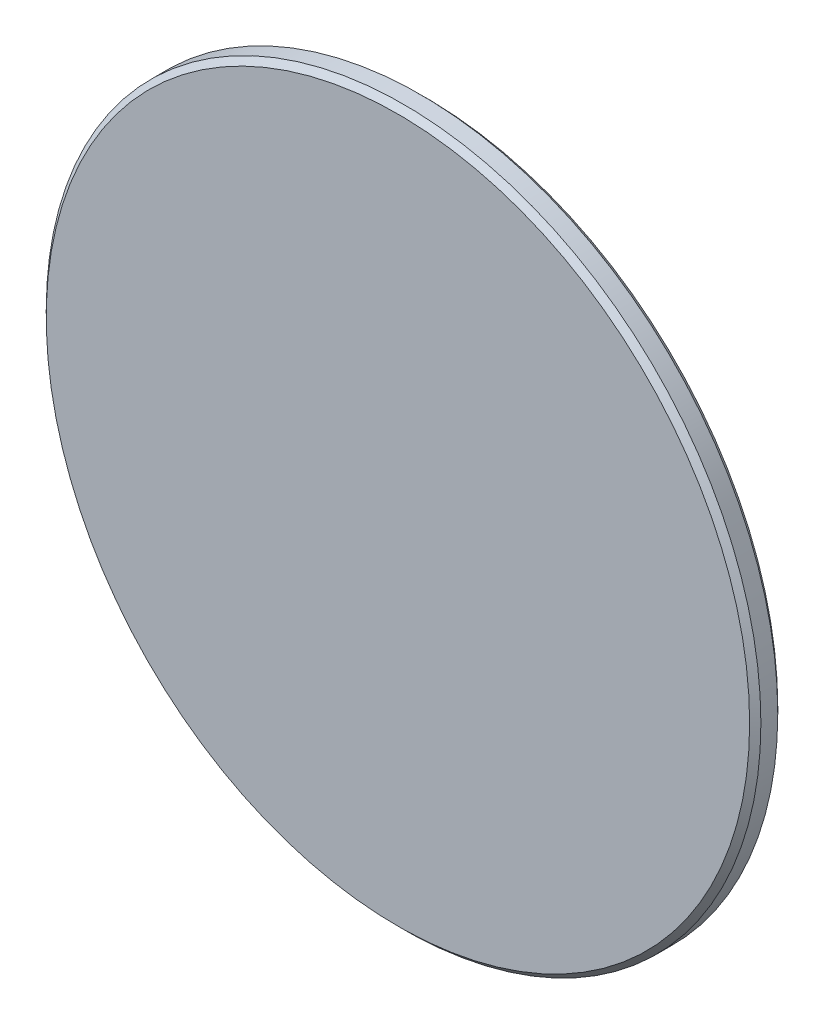
ISO-10303-21;
HEADER;
FILE_DESCRIPTION(('STEP AP214'),'2;1');
FILE_NAME('part.step','',(''),(''),'','','');
FILE_SCHEMA(('AUTOMOTIVE_DESIGN { 1 0 10303 214 1 1 1 1 }'));
ENDSEC;
DATA;
#1=APPLICATION_CONTEXT('core data for automotive mechanical design processes');
#2=APPLICATION_PROTOCOL_DEFINITION('international standard','automotive_design',2000,#1);
#3=PRODUCT_CONTEXT('',#1,'mechanical');
#4=PRODUCT('Part','Part','',(#3));
#5=PRODUCT_RELATED_PRODUCT_CATEGORY('part','',(#4));
#6=PRODUCT_DEFINITION_FORMATION('','',#4);
#7=PRODUCT_DEFINITION_CONTEXT('part definition',#1,'design');
#8=PRODUCT_DEFINITION('design','',#6,#7);
#9=PRODUCT_DEFINITION_SHAPE('','',#8);
#10=(LENGTH_UNIT() NAMED_UNIT(*) SI_UNIT(.MILLI.,.METRE.));
#11=(NAMED_UNIT(*) PLANE_ANGLE_UNIT() SI_UNIT($,.RADIAN.));
#12=(NAMED_UNIT(*) SI_UNIT($,.STERADIAN.) SOLID_ANGLE_UNIT());
#13=UNCERTAINTY_MEASURE_WITH_UNIT(LENGTH_MEASURE(1.E-05),#10,'distance_accuracy_value','');
#14=(GEOMETRIC_REPRESENTATION_CONTEXT(3) GLOBAL_UNCERTAINTY_ASSIGNED_CONTEXT((#13)) GLOBAL_UNIT_ASSIGNED_CONTEXT((#10,
#11,#12)) REPRESENTATION_CONTEXT('',''));
#15=CARTESIAN_POINT('',(0.,0.,0.));
#16=DIRECTION('',(0.,0.,1.));
#17=DIRECTION('',(1.,0.,0.));
#18=AXIS2_PLACEMENT_3D('',#15,#16,#17);
#19=CARTESIAN_POINT('',(0.,0.,0.5));
#20=DIRECTION('',(0.,0.,-1.));
#21=DIRECTION('',(-1.,0.,0.));
#22=AXIS2_PLACEMENT_3D('',#19,#20,#21);
#23=CYLINDRICAL_SURFACE('',#22,12.7);
#24=CARTESIAN_POINT('',(0.,0.,-0.299999999999999));
#25=DIRECTION('',(0.,0.,1.));
#26=DIRECTION('',(1.,0.,0.));
#27=AXIS2_PLACEMENT_3D('',#24,#25,#26);
#28=CIRCLE('',#27,12.7);
#29=CARTESIAN_POINT('',(12.7,0.,-0.299999999999999));
#30=VERTEX_POINT('',#29);
#31=EDGE_CURVE('E29',#30,#30,#28,.T.);
#32=ORIENTED_EDGE('',*,*,#31,.T.);
#33=EDGE_LOOP('',(#32));
#34=FACE_BOUND('',#33,.T.);
#35=CARTESIAN_POINT('',(0.,0.,0.299999999999993));
#36=DIRECTION('',(0.,0.,1.));
#37=DIRECTION('',(1.,0.,0.));
#38=AXIS2_PLACEMENT_3D('',#35,#36,#37);
#39=CIRCLE('',#38,12.7);
#40=CARTESIAN_POINT('',(12.7,0.,0.299999999999993));
#41=VERTEX_POINT('',#40);
#42=EDGE_CURVE('E35',#41,#41,#39,.F.);
#43=ORIENTED_EDGE('',*,*,#42,.T.);
#44=EDGE_LOOP('',(#43));
#45=FACE_BOUND('',#44,.T.);
#46=ADVANCED_FACE('F14',(#34,#45),#23,.T.);
#47=CARTESIAN_POINT('',(0.,0.,0.5));
#48=DIRECTION('',(0.,0.,1.));
#49=DIRECTION('',(1.,0.,0.));
#50=AXIS2_PLACEMENT_3D('',#47,#48,#49);
#51=PLANE('',#50);
#52=CARTESIAN_POINT('',(0.,0.,0.5));
#53=DIRECTION('',(0.,0.,1.));
#54=DIRECTION('',(1.,0.,0.));
#55=AXIS2_PLACEMENT_3D('',#52,#53,#54);
#56=CIRCLE('',#55,12.5);
#57=CARTESIAN_POINT('',(12.5,0.,0.5));
#58=VERTEX_POINT('',#57);
#59=EDGE_CURVE('E10',#58,#58,#56,.T.);
#60=ORIENTED_EDGE('',*,*,#59,.T.);
#61=EDGE_LOOP('',(#60));
#62=FACE_BOUND('',#61,.T.);
#63=ADVANCED_FACE('F54',(#62),#51,.T.);
#64=CARTESIAN_POINT('',(0.,0.,-0.5));
#65=DIRECTION('',(0.,0.,1.));
#66=DIRECTION('',(1.,0.,0.));
#67=AXIS2_PLACEMENT_3D('',#64,#65,#66);
#68=PLANE('',#67);
#69=CARTESIAN_POINT('',(0.,0.,-0.5));
#70=DIRECTION('',(0.,0.,1.));
#71=DIRECTION('',(1.,0.,0.));
#72=AXIS2_PLACEMENT_3D('',#69,#70,#71);
#73=CIRCLE('',#72,12.5);
#74=CARTESIAN_POINT('',(12.5,0.,-0.5));
#75=VERTEX_POINT('',#74);
#76=EDGE_CURVE('E22',#75,#75,#73,.F.);
#77=ORIENTED_EDGE('',*,*,#76,.T.);
#78=EDGE_LOOP('',(#77));
#79=FACE_BOUND('',#78,.T.);
#80=ADVANCED_FACE('F51',(#79),#68,.F.);
#81=CARTESIAN_POINT('',(0.,0.,-0.299999999999999));
#82=DIRECTION('',(0.,0.,1.));
#83=DIRECTION('',(1.,0.,0.));
#84=AXIS2_PLACEMENT_3D('',#81,#82,#83);
#85=CONICAL_SURFACE('',#84,12.7,0.785398163397453);
#86=ORIENTED_EDGE('',*,*,#76,.F.);
#87=EDGE_LOOP('',(#86));
#88=FACE_BOUND('',#87,.T.);
#89=ORIENTED_EDGE('',*,*,#31,.F.);
#90=EDGE_LOOP('',(#89));
#91=FACE_BOUND('',#90,.T.);
#92=ADVANCED_FACE('F46',(#88,#91),#85,.T.);
#93=CARTESIAN_POINT('',(0.,0.,0.5));
#94=DIRECTION('',(0.,0.,-1.));
#95=DIRECTION('',(-1.,0.,0.));
#96=AXIS2_PLACEMENT_3D('',#93,#94,#95);
#97=CONICAL_SURFACE('',#96,12.5,0.78539816339744);
#98=ORIENTED_EDGE('',*,*,#42,.F.);
#99=EDGE_LOOP('',(#98));
#100=FACE_BOUND('',#99,.T.);
#101=ORIENTED_EDGE('',*,*,#59,.F.);
#102=EDGE_LOOP('',(#101));
#103=FACE_BOUND('',#102,.T.);
#104=ADVANCED_FACE('F16',(#100,#103),#97,.T.);
#105=CLOSED_SHELL('',(#46,#63,#80,#92,#104));
#106=MANIFOLD_SOLID_BREP('B1',#105);
#107=ADVANCED_BREP_SHAPE_REPRESENTATION('',(#18,#106),#14);
#108=SHAPE_DEFINITION_REPRESENTATION(#9,#107);
ENDSEC;
END-ISO-10303-21;
